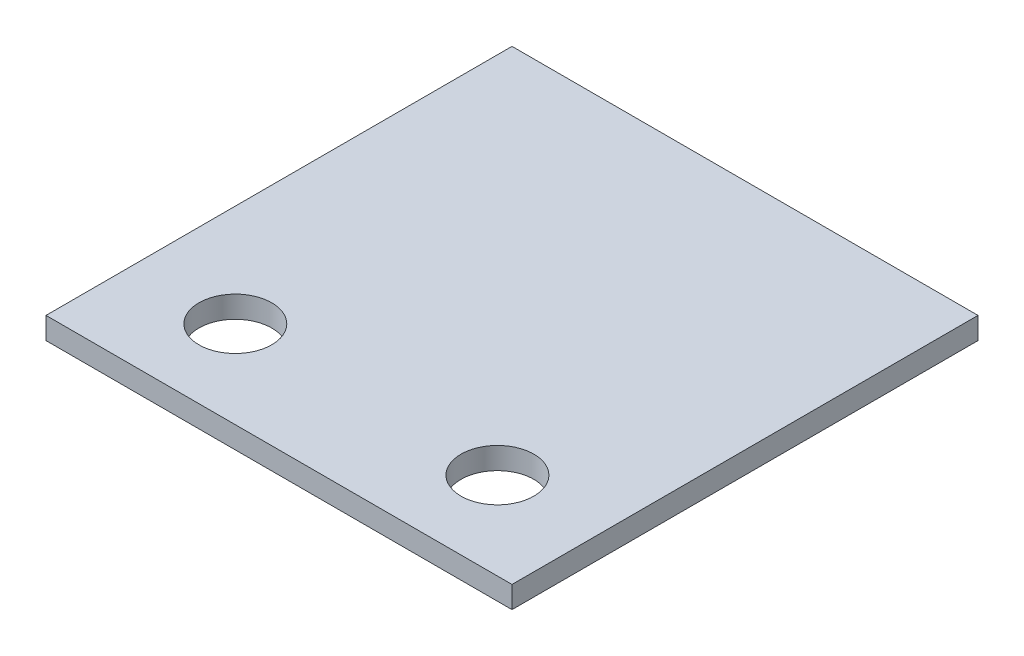
ISO-10303-21;
HEADER;
FILE_DESCRIPTION(('STEP AP214'),'2;1');
FILE_NAME('part.step','',(''),(''),'','','');
FILE_SCHEMA(('AUTOMOTIVE_DESIGN { 1 0 10303 214 1 1 1 1 }'));
ENDSEC;
DATA;
#1=APPLICATION_CONTEXT('core data for automotive mechanical design processes');
#2=APPLICATION_PROTOCOL_DEFINITION('international standard','automotive_design',2000,#1);
#3=PRODUCT_CONTEXT('',#1,'mechanical');
#4=PRODUCT('Part','Part','',(#3));
#5=PRODUCT_RELATED_PRODUCT_CATEGORY('part','',(#4));
#6=PRODUCT_DEFINITION_FORMATION('','',#4);
#7=PRODUCT_DEFINITION_CONTEXT('part definition',#1,'design');
#8=PRODUCT_DEFINITION('design','',#6,#7);
#9=PRODUCT_DEFINITION_SHAPE('','',#8);
#10=(LENGTH_UNIT() NAMED_UNIT(*) SI_UNIT(.MILLI.,.METRE.));
#11=(NAMED_UNIT(*) PLANE_ANGLE_UNIT() SI_UNIT($,.RADIAN.));
#12=(NAMED_UNIT(*) SI_UNIT($,.STERADIAN.) SOLID_ANGLE_UNIT());
#13=UNCERTAINTY_MEASURE_WITH_UNIT(LENGTH_MEASURE(1.E-05),#10,'distance_accuracy_value','');
#14=(GEOMETRIC_REPRESENTATION_CONTEXT(3) GLOBAL_UNCERTAINTY_ASSIGNED_CONTEXT((#13)) GLOBAL_UNIT_ASSIGNED_CONTEXT((#10,
#11,#12)) REPRESENTATION_CONTEXT('',''));
#15=CARTESIAN_POINT('',(0.,0.,0.));
#16=DIRECTION('',(0.,0.,1.));
#17=DIRECTION('',(1.,0.,0.));
#18=AXIS2_PLACEMENT_3D('',#15,#16,#17);
#19=CARTESIAN_POINT('',(16.,1.5,16.));
#20=DIRECTION('',(-1.,0.,0.));
#21=DIRECTION('',(0.,0.,1.));
#22=AXIS2_PLACEMENT_3D('',#19,#20,#21);
#23=PLANE('',#22);
#24=DIRECTION('',(0.,0.,-1.));
#25=VECTOR('',#24,1.);
#26=CARTESIAN_POINT('',(16.,0.,16.));
#27=LINE('',#26,#25);
#28=CARTESIAN_POINT('',(16.,0.,16.));
#29=VERTEX_POINT('',#28);
#30=CARTESIAN_POINT('',(16.,0.,-16.));
#31=VERTEX_POINT('',#30);
#32=EDGE_CURVE('E96',#29,#31,#27,.T.);
#33=ORIENTED_EDGE('',*,*,#32,.T.);
#34=DIRECTION('',(0.,-1.,0.));
#35=VECTOR('',#34,1.);
#36=CARTESIAN_POINT('',(16.,1.5,-16.));
#37=LINE('',#36,#35);
#38=CARTESIAN_POINT('',(16.,1.5,-16.));
#39=VERTEX_POINT('',#38);
#40=EDGE_CURVE('E11',#39,#31,#37,.T.);
#41=ORIENTED_EDGE('',*,*,#40,.F.);
#42=DIRECTION('',(0.,0.,-1.));
#43=VECTOR('',#42,1.);
#44=CARTESIAN_POINT('',(16.,1.5,16.));
#45=LINE('',#44,#43);
#46=CARTESIAN_POINT('',(16.,1.5,16.));
#47=VERTEX_POINT('',#46);
#48=EDGE_CURVE('E84',#47,#39,#45,.T.);
#49=ORIENTED_EDGE('',*,*,#48,.F.);
#50=DIRECTION('',(0.,-1.,0.));
#51=VECTOR('',#50,1.);
#52=CARTESIAN_POINT('',(16.,1.5,16.));
#53=LINE('',#52,#51);
#54=EDGE_CURVE('E92',#47,#29,#53,.T.);
#55=ORIENTED_EDGE('',*,*,#54,.T.);
#56=EDGE_LOOP('',(#33,#41,#49,#55));
#57=FACE_BOUND('',#56,.T.);
#58=ADVANCED_FACE('F33',(#57),#23,.F.);
#59=CARTESIAN_POINT('',(-16.,1.5,-16.));
#60=DIRECTION('',(0.,0.,1.));
#61=DIRECTION('',(1.,0.,0.));
#62=AXIS2_PLACEMENT_3D('',#59,#60,#61);
#63=PLANE('',#62);
#64=DIRECTION('',(-1.,0.,0.));
#65=VECTOR('',#64,1.);
#66=CARTESIAN_POINT('',(-16.,0.,-16.));
#67=LINE('',#66,#65);
#68=CARTESIAN_POINT('',(-16.,0.,-16.));
#69=VERTEX_POINT('',#68);
#70=EDGE_CURVE('E88',#31,#69,#67,.T.);
#71=ORIENTED_EDGE('',*,*,#70,.T.);
#72=DIRECTION('',(0.,-1.,0.));
#73=VECTOR('',#72,1.);
#74=CARTESIAN_POINT('',(-16.,1.5,-16.));
#75=LINE('',#74,#73);
#76=CARTESIAN_POINT('',(-16.,1.5,-16.));
#77=VERTEX_POINT('',#76);
#78=EDGE_CURVE('E41',#77,#69,#75,.T.);
#79=ORIENTED_EDGE('',*,*,#78,.F.);
#80=DIRECTION('',(-1.,0.,0.));
#81=VECTOR('',#80,1.);
#82=CARTESIAN_POINT('',(-16.,1.5,-16.));
#83=LINE('',#82,#81);
#84=EDGE_CURVE('E79',#39,#77,#83,.T.);
#85=ORIENTED_EDGE('',*,*,#84,.F.);
#86=ORIENTED_EDGE('',*,*,#40,.T.);
#87=EDGE_LOOP('',(#71,#79,#85,#86));
#88=FACE_BOUND('',#87,.T.);
#89=ADVANCED_FACE('F87',(#88),#63,.F.);
#90=CARTESIAN_POINT('',(-16.,1.5,16.));
#91=DIRECTION('',(1.,0.,0.));
#92=DIRECTION('',(0.,0.,-1.));
#93=AXIS2_PLACEMENT_3D('',#90,#91,#92);
#94=PLANE('',#93);
#95=DIRECTION('',(0.,0.,1.));
#96=VECTOR('',#95,1.);
#97=CARTESIAN_POINT('',(-16.,0.,16.));
#98=LINE('',#97,#96);
#99=CARTESIAN_POINT('',(-16.,0.,16.));
#100=VERTEX_POINT('',#99);
#101=EDGE_CURVE('E66',#69,#100,#98,.T.);
#102=ORIENTED_EDGE('',*,*,#101,.T.);
#103=DIRECTION('',(0.,-1.,0.));
#104=VECTOR('',#103,1.);
#105=CARTESIAN_POINT('',(-16.,1.5,16.));
#106=LINE('',#105,#104);
#107=CARTESIAN_POINT('',(-16.,1.5,16.));
#108=VERTEX_POINT('',#107);
#109=EDGE_CURVE('E89',#108,#100,#106,.T.);
#110=ORIENTED_EDGE('',*,*,#109,.F.);
#111=DIRECTION('',(0.,0.,1.));
#112=VECTOR('',#111,1.);
#113=CARTESIAN_POINT('',(-16.,1.5,16.));
#114=LINE('',#113,#112);
#115=EDGE_CURVE('E82',#77,#108,#114,.T.);
#116=ORIENTED_EDGE('',*,*,#115,.F.);
#117=ORIENTED_EDGE('',*,*,#78,.T.);
#118=EDGE_LOOP('',(#102,#110,#116,#117));
#119=FACE_BOUND('',#118,.T.);
#120=ADVANCED_FACE('F90',(#119),#94,.F.);
#121=CARTESIAN_POINT('',(-16.,1.5,16.));
#122=DIRECTION('',(0.,0.,-1.));
#123=DIRECTION('',(-1.,0.,0.));
#124=AXIS2_PLACEMENT_3D('',#121,#122,#123);
#125=PLANE('',#124);
#126=DIRECTION('',(1.,0.,0.));
#127=VECTOR('',#126,1.);
#128=CARTESIAN_POINT('',(-16.,0.,16.));
#129=LINE('',#128,#127);
#130=EDGE_CURVE('E72',#100,#29,#129,.T.);
#131=ORIENTED_EDGE('',*,*,#130,.T.);
#132=ORIENTED_EDGE('',*,*,#54,.F.);
#133=DIRECTION('',(1.,0.,0.));
#134=VECTOR('',#133,1.);
#135=CARTESIAN_POINT('',(-16.,1.5,16.));
#136=LINE('',#135,#134);
#137=EDGE_CURVE('E49',#108,#47,#136,.T.);
#138=ORIENTED_EDGE('',*,*,#137,.F.);
#139=ORIENTED_EDGE('',*,*,#109,.T.);
#140=EDGE_LOOP('',(#131,#132,#138,#139));
#141=FACE_BOUND('',#140,.T.);
#142=ADVANCED_FACE('F104',(#141),#125,.F.);
#143=CARTESIAN_POINT('',(0.,1.5,0.));
#144=DIRECTION('',(0.,-1.,0.));
#145=DIRECTION('',(0.,0.,-1.));
#146=AXIS2_PLACEMENT_3D('',#143,#144,#145);
#147=PLANE('',#146);
#148=CARTESIAN_POINT('',(-9.,1.5,10.));
#149=DIRECTION('',(0.,-1.,0.));
#150=DIRECTION('',(0.,0.,1.));
#151=AXIS2_PLACEMENT_3D('',#148,#149,#150);
#152=CIRCLE('',#151,2.5);
#153=CARTESIAN_POINT('',(-9.,1.5,12.5));
#154=VERTEX_POINT('',#153);
#155=EDGE_CURVE('E116',#154,#154,#152,.T.);
#156=ORIENTED_EDGE('',*,*,#155,.T.);
#157=EDGE_LOOP('',(#156));
#158=FACE_BOUND('',#157,.T.);
#159=CARTESIAN_POINT('',(9.,1.5,10.));
#160=DIRECTION('',(0.,1.,0.));
#161=DIRECTION('',(0.,0.,1.));
#162=AXIS2_PLACEMENT_3D('',#159,#160,#161);
#163=CIRCLE('',#162,2.5);
#164=CARTESIAN_POINT('',(9.,1.5,12.5));
#165=VERTEX_POINT('',#164);
#166=EDGE_CURVE('E110',#165,#165,#163,.T.);
#167=ORIENTED_EDGE('',*,*,#166,.F.);
#168=EDGE_LOOP('',(#167));
#169=FACE_BOUND('',#168,.T.);
#170=ORIENTED_EDGE('',*,*,#48,.T.);
#171=ORIENTED_EDGE('',*,*,#84,.T.);
#172=ORIENTED_EDGE('',*,*,#115,.T.);
#173=ORIENTED_EDGE('',*,*,#137,.T.);
#174=EDGE_LOOP('',(#170,#171,#172,#173));
#175=FACE_BOUND('',#174,.T.);
#176=ADVANCED_FACE('F80',(#158,#169,#175),#147,.F.);
#177=CARTESIAN_POINT('',(0.,0.,0.));
#178=DIRECTION('',(0.,-1.,0.));
#179=DIRECTION('',(0.,0.,-1.));
#180=AXIS2_PLACEMENT_3D('',#177,#178,#179);
#181=PLANE('',#180);
#182=CARTESIAN_POINT('',(-9.,0.,10.));
#183=DIRECTION('',(0.,-1.,0.));
#184=DIRECTION('',(0.,0.,1.));
#185=AXIS2_PLACEMENT_3D('',#182,#183,#184);
#186=CIRCLE('',#185,2.5);
#187=CARTESIAN_POINT('',(-9.,0.,12.5));
#188=VERTEX_POINT('',#187);
#189=EDGE_CURVE('E113',#188,#188,#186,.T.);
#190=ORIENTED_EDGE('',*,*,#189,.F.);
#191=EDGE_LOOP('',(#190));
#192=FACE_BOUND('',#191,.T.);
#193=CARTESIAN_POINT('',(9.,0.,10.));
#194=DIRECTION('',(0.,1.,0.));
#195=DIRECTION('',(0.,0.,1.));
#196=AXIS2_PLACEMENT_3D('',#193,#194,#195);
#197=CIRCLE('',#196,2.5);
#198=CARTESIAN_POINT('',(9.,0.,12.5));
#199=VERTEX_POINT('',#198);
#200=EDGE_CURVE('E99',#199,#199,#197,.T.);
#201=ORIENTED_EDGE('',*,*,#200,.T.);
#202=EDGE_LOOP('',(#201));
#203=FACE_BOUND('',#202,.T.);
#204=ORIENTED_EDGE('',*,*,#32,.F.);
#205=ORIENTED_EDGE('',*,*,#130,.F.);
#206=ORIENTED_EDGE('',*,*,#101,.F.);
#207=ORIENTED_EDGE('',*,*,#70,.F.);
#208=EDGE_LOOP('',(#204,#205,#206,#207));
#209=FACE_BOUND('',#208,.T.);
#210=ADVANCED_FACE('F107',(#192,#203,#209),#181,.T.);
#211=CARTESIAN_POINT('',(9.,0.,10.));
#212=DIRECTION('',(0.,1.,0.));
#213=DIRECTION('',(0.,0.,1.));
#214=AXIS2_PLACEMENT_3D('',#211,#212,#213);
#215=CYLINDRICAL_SURFACE('',#214,2.5);
#216=ORIENTED_EDGE('',*,*,#200,.F.);
#217=EDGE_LOOP('',(#216));
#218=FACE_BOUND('',#217,.T.);
#219=ORIENTED_EDGE('',*,*,#166,.T.);
#220=EDGE_LOOP('',(#219));
#221=FACE_BOUND('',#220,.T.);
#222=ADVANCED_FACE('F127',(#218,#221),#215,.F.);
#223=CARTESIAN_POINT('',(-9.,0.,10.));
#224=DIRECTION('',(0.,1.,0.));
#225=DIRECTION('',(0.,0.,1.));
#226=AXIS2_PLACEMENT_3D('',#223,#224,#225);
#227=CYLINDRICAL_SURFACE('',#226,2.5);
#228=ORIENTED_EDGE('',*,*,#189,.T.);
#229=EDGE_LOOP('',(#228));
#230=FACE_BOUND('',#229,.T.);
#231=ORIENTED_EDGE('',*,*,#155,.F.);
#232=EDGE_LOOP('',(#231));
#233=FACE_BOUND('',#232,.T.);
#234=ADVANCED_FACE('F122',(#230,#233),#227,.F.);
#235=CLOSED_SHELL('',(#58,#89,#120,#142,#176,#210,#222,#234));
#236=MANIFOLD_SOLID_BREP('B2',#235);
#237=ADVANCED_BREP_SHAPE_REPRESENTATION('',(#18,#236),#14);
#238=SHAPE_DEFINITION_REPRESENTATION(#9,#237);
ENDSEC;
END-ISO-10303-21;
